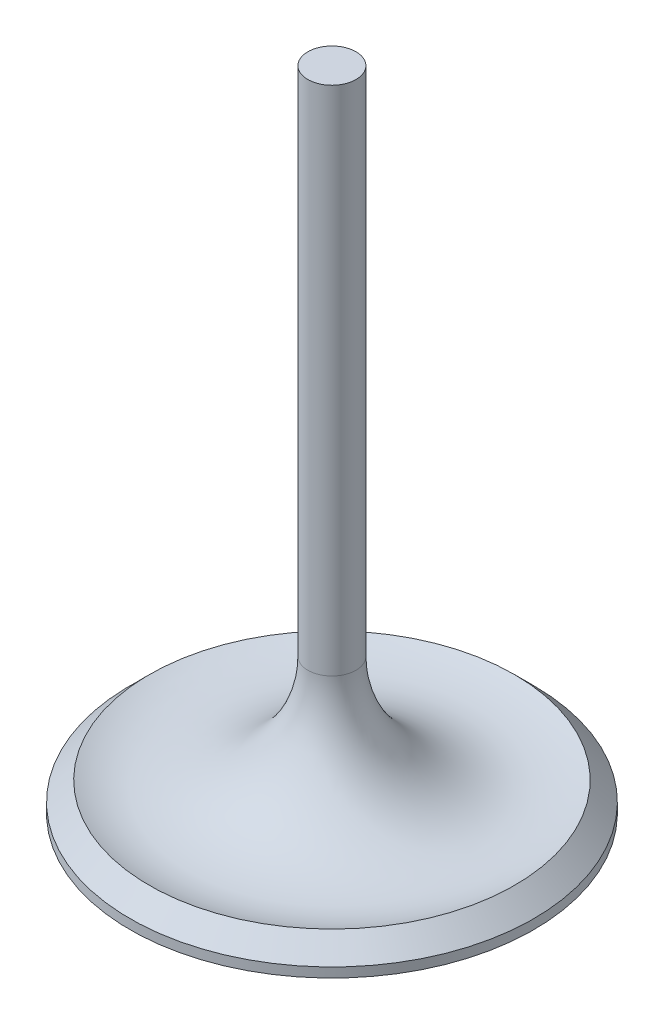
ISO-10303-21;
HEADER;
FILE_DESCRIPTION(('STEP AP214'),'2;1');
FILE_NAME('part.step','',(''),(''),'','','');
FILE_SCHEMA(('AUTOMOTIVE_DESIGN { 1 0 10303 214 1 1 1 1 }'));
ENDSEC;
DATA;
#1=APPLICATION_CONTEXT('core data for automotive mechanical design processes');
#2=APPLICATION_PROTOCOL_DEFINITION('international standard','automotive_design',2000,#1);
#3=PRODUCT_CONTEXT('',#1,'mechanical');
#4=PRODUCT('Part','Part','',(#3));
#5=PRODUCT_RELATED_PRODUCT_CATEGORY('part','',(#4));
#6=PRODUCT_DEFINITION_FORMATION('','',#4);
#7=PRODUCT_DEFINITION_CONTEXT('part definition',#1,'design');
#8=PRODUCT_DEFINITION('design','',#6,#7);
#9=PRODUCT_DEFINITION_SHAPE('','',#8);
#10=(LENGTH_UNIT() NAMED_UNIT(*) SI_UNIT(.MILLI.,.METRE.));
#11=(NAMED_UNIT(*) PLANE_ANGLE_UNIT() SI_UNIT($,.RADIAN.));
#12=(NAMED_UNIT(*) SI_UNIT($,.STERADIAN.) SOLID_ANGLE_UNIT());
#13=UNCERTAINTY_MEASURE_WITH_UNIT(LENGTH_MEASURE(1.E-05),#10,'distance_accuracy_value','');
#14=(GEOMETRIC_REPRESENTATION_CONTEXT(3) GLOBAL_UNCERTAINTY_ASSIGNED_CONTEXT((#13)) GLOBAL_UNIT_ASSIGNED_CONTEXT((#10,
#11,#12)) REPRESENTATION_CONTEXT('',''));
#15=CARTESIAN_POINT('',(0.,0.,0.));
#16=DIRECTION('',(0.,0.,1.));
#17=DIRECTION('',(1.,0.,0.));
#18=AXIS2_PLACEMENT_3D('',#15,#16,#17);
#19=CARTESIAN_POINT('',(0.,0.,0.));
#20=DIRECTION('',(0.,-1.,0.));
#21=DIRECTION('',(0.,0.,-1.));
#22=AXIS2_PLACEMENT_3D('',#19,#20,#21);
#23=PLANE('',#22);
#24=CARTESIAN_POINT('',(0.,0.,0.));
#25=DIRECTION('',(0.,-1.,0.));
#26=DIRECTION('',(0.,0.,-1.));
#27=AXIS2_PLACEMENT_3D('',#24,#25,#26);
#28=CIRCLE('',#27,26.67);
#29=CARTESIAN_POINT('',(0.,0.,-26.67));
#30=VERTEX_POINT('',#29);
#31=EDGE_CURVE('E10',#30,#30,#28,.T.);
#32=ORIENTED_EDGE('',*,*,#31,.T.);
#33=EDGE_LOOP('',(#32));
#34=FACE_BOUND('',#33,.T.);
#35=ADVANCED_FACE('F37',(#34),#23,.T.);
#36=CARTESIAN_POINT('',(0.,0.,0.));
#37=DIRECTION('',(0.,-1.,0.));
#38=DIRECTION('',(0.,0.,-1.));
#39=AXIS2_PLACEMENT_3D('',#36,#37,#38);
#40=CYLINDRICAL_SURFACE('',#39,26.67);
#41=CARTESIAN_POINT('',(0.,1.27,0.));
#42=DIRECTION('',(0.,-1.,0.));
#43=DIRECTION('',(0.,0.,-1.));
#44=AXIS2_PLACEMENT_3D('',#41,#42,#43);
#45=CIRCLE('',#44,26.67);
#46=CARTESIAN_POINT('',(0.,1.27,-26.67));
#47=VERTEX_POINT('',#46);
#48=EDGE_CURVE('E44',#47,#47,#45,.T.);
#49=ORIENTED_EDGE('',*,*,#48,.T.);
#50=EDGE_LOOP('',(#49));
#51=FACE_BOUND('',#50,.T.);
#52=ORIENTED_EDGE('',*,*,#31,.F.);
#53=EDGE_LOOP('',(#52));
#54=FACE_BOUND('',#53,.T.);
#55=ADVANCED_FACE('F77',(#51,#54),#40,.T.);
#56=CARTESIAN_POINT('',(0.,1.27,0.));
#57=DIRECTION('',(0.,-1.,0.));
#58=DIRECTION('',(0.,0.,-1.));
#59=AXIS2_PLACEMENT_3D('',#56,#57,#58);
#60=CONICAL_SURFACE('',#59,26.67,0.785398163397454);
#61=CARTESIAN_POINT('',(0.,3.81,0.));
#62=DIRECTION('',(0.,-1.,0.));
#63=DIRECTION('',(0.,0.,-1.));
#64=AXIS2_PLACEMENT_3D('',#61,#62,#63);
#65=CIRCLE('',#64,24.13);
#66=CARTESIAN_POINT('',(0.,3.81,-24.13));
#67=VERTEX_POINT('',#66);
#68=EDGE_CURVE('E49',#67,#67,#65,.T.);
#69=ORIENTED_EDGE('',*,*,#68,.T.);
#70=EDGE_LOOP('',(#69));
#71=FACE_BOUND('',#70,.T.);
#72=ORIENTED_EDGE('',*,*,#48,.F.);
#73=EDGE_LOOP('',(#72));
#74=FACE_BOUND('',#73,.T.);
#75=ADVANCED_FACE('F81',(#71,#74),#60,.T.);
#76=CARTESIAN_POINT('',(0.,17.9546986535592,0.));
#77=DIRECTION('',(0.,-1.,0.));
#78=DIRECTION('',(0.,0.,-1.));
#79=AXIS2_PLACEMENT_3D('',#76,#77,#78);
#80=TOROIDAL_SURFACE('',#79,18.43,15.25);
#81=CARTESIAN_POINT('',(0.,17.9546986535592,0.));
#82=DIRECTION('',(0.,-1.,0.));
#83=DIRECTION('',(0.,0.,-1.));
#84=AXIS2_PLACEMENT_3D('',#81,#82,#83);
#85=CIRCLE('',#84,3.18000000000001);
#86=CARTESIAN_POINT('',(0.,17.9546986535592,-3.18000000000001));
#87=VERTEX_POINT('',#86);
#88=EDGE_CURVE('E54',#87,#87,#85,.T.);
#89=ORIENTED_EDGE('',*,*,#88,.T.);
#90=EDGE_LOOP('',(#89));
#91=FACE_BOUND('',#90,.T.);
#92=ORIENTED_EDGE('',*,*,#68,.F.);
#93=EDGE_LOOP('',(#92));
#94=FACE_BOUND('',#93,.T.);
#95=ADVANCED_FACE('F74',(#91,#94),#80,.F.);
#96=CARTESIAN_POINT('',(0.,0.,0.));
#97=DIRECTION('',(0.,-1.,0.));
#98=DIRECTION('',(0.,0.,-1.));
#99=AXIS2_PLACEMENT_3D('',#96,#97,#98);
#100=CYLINDRICAL_SURFACE('',#99,3.18);
#101=CARTESIAN_POINT('',(0.,85.55,0.));
#102=DIRECTION('',(0.,-1.,0.));
#103=DIRECTION('',(0.,0.,-1.));
#104=AXIS2_PLACEMENT_3D('',#101,#102,#103);
#105=CIRCLE('',#104,3.18);
#106=CARTESIAN_POINT('',(0.,85.55,-3.18));
#107=VERTEX_POINT('',#106);
#108=EDGE_CURVE('E60',#107,#107,#105,.T.);
#109=ORIENTED_EDGE('',*,*,#108,.T.);
#110=EDGE_LOOP('',(#109));
#111=FACE_BOUND('',#110,.T.);
#112=ORIENTED_EDGE('',*,*,#88,.F.);
#113=EDGE_LOOP('',(#112));
#114=FACE_BOUND('',#113,.T.);
#115=ADVANCED_FACE('F65',(#111,#114),#100,.T.);
#116=CARTESIAN_POINT('',(0.,85.55,0.));
#117=DIRECTION('',(0.,1.,0.));
#118=DIRECTION('',(0.,0.,1.));
#119=AXIS2_PLACEMENT_3D('',#116,#117,#118);
#120=PLANE('',#119);
#121=ORIENTED_EDGE('',*,*,#108,.F.);
#122=EDGE_LOOP('',(#121));
#123=FACE_BOUND('',#122,.T.);
#124=ADVANCED_FACE('F68',(#123),#120,.T.);
#125=CLOSED_SHELL('',(#35,#55,#75,#95,#115,#124));
#126=MANIFOLD_SOLID_BREP('B2',#125);
#127=ADVANCED_BREP_SHAPE_REPRESENTATION('',(#18,#126),#14);
#128=SHAPE_DEFINITION_REPRESENTATION(#9,#127);
ENDSEC;
END-ISO-10303-21;
